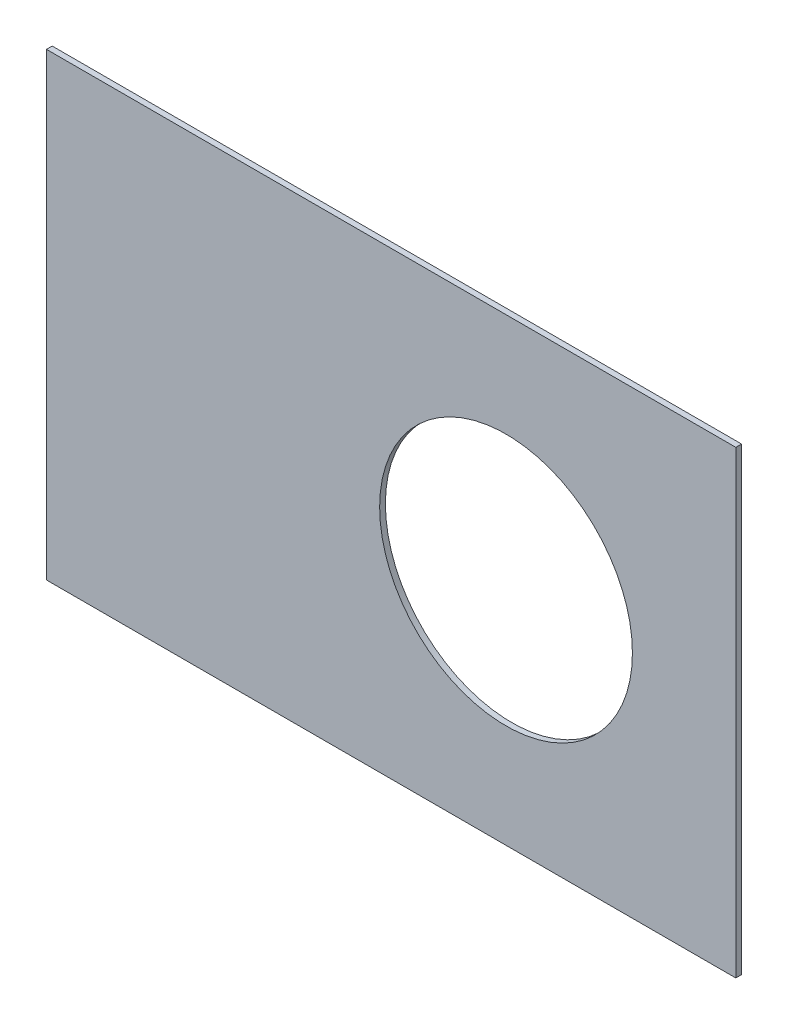
ISO-10303-21;
HEADER;
FILE_DESCRIPTION(('STEP AP214'),'2;1');
FILE_NAME('part.step','',(''),(''),'','','');
FILE_SCHEMA(('AUTOMOTIVE_DESIGN { 1 0 10303 214 1 1 1 1 }'));
ENDSEC;
DATA;
#1=APPLICATION_CONTEXT('core data for automotive mechanical design processes');
#2=APPLICATION_PROTOCOL_DEFINITION('international standard','automotive_design',2000,#1);
#3=PRODUCT_CONTEXT('',#1,'mechanical');
#4=PRODUCT('Part','Part','',(#3));
#5=PRODUCT_RELATED_PRODUCT_CATEGORY('part','',(#4));
#6=PRODUCT_DEFINITION_FORMATION('','',#4);
#7=PRODUCT_DEFINITION_CONTEXT('part definition',#1,'design');
#8=PRODUCT_DEFINITION('design','',#6,#7);
#9=PRODUCT_DEFINITION_SHAPE('','',#8);
#10=(LENGTH_UNIT() NAMED_UNIT(*) SI_UNIT(.MILLI.,.METRE.));
#11=(NAMED_UNIT(*) PLANE_ANGLE_UNIT() SI_UNIT($,.RADIAN.));
#12=(NAMED_UNIT(*) SI_UNIT($,.STERADIAN.) SOLID_ANGLE_UNIT());
#13=UNCERTAINTY_MEASURE_WITH_UNIT(LENGTH_MEASURE(1.E-05),#10,'distance_accuracy_value','');
#14=(GEOMETRIC_REPRESENTATION_CONTEXT(3) GLOBAL_UNCERTAINTY_ASSIGNED_CONTEXT((#13)) GLOBAL_UNIT_ASSIGNED_CONTEXT((#10,
#11,#12)) REPRESENTATION_CONTEXT('',''));
#15=CARTESIAN_POINT('',(0.,0.,0.));
#16=DIRECTION('',(0.,0.,1.));
#17=DIRECTION('',(1.,0.,0.));
#18=AXIS2_PLACEMENT_3D('',#15,#16,#17);
#19=CARTESIAN_POINT('',(10.,0.,-10.));
#20=DIRECTION('',(0.,0.,1.));
#21=DIRECTION('',(1.,0.,0.));
#22=AXIS2_PLACEMENT_3D('',#19,#20,#21);
#23=CYLINDRICAL_SURFACE('',#22,11.);
#24=CARTESIAN_POINT('',(10.,0.,-0.5));
#25=DIRECTION('',(0.,0.,-1.));
#26=DIRECTION('',(-1.,0.,0.));
#27=AXIS2_PLACEMENT_3D('',#24,#25,#26);
#28=CIRCLE('',#27,11.);
#29=CARTESIAN_POINT('',(-0.999999999999999,0.,-0.5));
#30=VERTEX_POINT('',#29);
#31=EDGE_CURVE('E20',#30,#30,#28,.T.);
#32=ORIENTED_EDGE('',*,*,#31,.T.);
#33=EDGE_LOOP('',(#32));
#34=FACE_BOUND('',#33,.T.);
#35=CARTESIAN_POINT('',(10.,0.,0.));
#36=DIRECTION('',(0.,0.,1.));
#37=DIRECTION('',(1.,0.,0.));
#38=AXIS2_PLACEMENT_3D('',#35,#36,#37);
#39=CIRCLE('',#38,11.);
#40=CARTESIAN_POINT('',(21.,0.,0.));
#41=VERTEX_POINT('',#40);
#42=EDGE_CURVE('E11',#41,#41,#39,.T.);
#43=ORIENTED_EDGE('',*,*,#42,.T.);
#44=EDGE_LOOP('',(#43));
#45=FACE_BOUND('',#44,.T.);
#46=ADVANCED_FACE('F17',(#34,#45),#23,.F.);
#47=CARTESIAN_POINT('',(0.,0.,0.));
#48=DIRECTION('',(0.,0.,-1.));
#49=DIRECTION('',(0.,-1.,0.));
#50=AXIS2_PLACEMENT_3D('',#47,#48,#49);
#51=PLANE('',#50);
#52=ORIENTED_EDGE('',*,*,#42,.F.);
#53=EDGE_LOOP('',(#52));
#54=FACE_BOUND('',#53,.T.);
#55=DIRECTION('',(0.,1.,0.));
#56=VECTOR('',#55,1.);
#57=CARTESIAN_POINT('',(30.,-20.,0.));
#58=LINE('',#57,#56);
#59=CARTESIAN_POINT('',(30.,-20.,0.));
#60=VERTEX_POINT('',#59);
#61=CARTESIAN_POINT('',(30.,20.,0.));
#62=VERTEX_POINT('',#61);
#63=EDGE_CURVE('E77',#60,#62,#58,.T.);
#64=ORIENTED_EDGE('',*,*,#63,.T.);
#65=DIRECTION('',(-1.,0.,0.));
#66=VECTOR('',#65,1.);
#67=CARTESIAN_POINT('',(-30.,20.,0.));
#68=LINE('',#67,#66);
#69=CARTESIAN_POINT('',(-30.,20.,0.));
#70=VERTEX_POINT('',#69);
#71=EDGE_CURVE('E49',#62,#70,#68,.T.);
#72=ORIENTED_EDGE('',*,*,#71,.T.);
#73=DIRECTION('',(0.,-1.,0.));
#74=VECTOR('',#73,1.);
#75=CARTESIAN_POINT('',(-30.,-20.,0.));
#76=LINE('',#75,#74);
#77=CARTESIAN_POINT('',(-30.,-20.,0.));
#78=VERTEX_POINT('',#77);
#79=EDGE_CURVE('E79',#70,#78,#76,.T.);
#80=ORIENTED_EDGE('',*,*,#79,.T.);
#81=DIRECTION('',(1.,0.,0.));
#82=VECTOR('',#81,1.);
#83=CARTESIAN_POINT('',(-30.,-20.,0.));
#84=LINE('',#83,#82);
#85=EDGE_CURVE('E73',#78,#60,#84,.T.);
#86=ORIENTED_EDGE('',*,*,#85,.T.);
#87=EDGE_LOOP('',(#64,#72,#80,#86));
#88=FACE_BOUND('',#87,.T.);
#89=ADVANCED_FACE('F75',(#54,#88),#51,.F.);
#90=CARTESIAN_POINT('',(0.,0.,-0.5));
#91=DIRECTION('',(0.,0.,-1.));
#92=DIRECTION('',(0.,-1.,0.));
#93=AXIS2_PLACEMENT_3D('',#90,#91,#92);
#94=PLANE('',#93);
#95=ORIENTED_EDGE('',*,*,#31,.F.);
#96=EDGE_LOOP('',(#95));
#97=FACE_BOUND('',#96,.T.);
#98=DIRECTION('',(0.,1.,0.));
#99=VECTOR('',#98,1.);
#100=CARTESIAN_POINT('',(30.,-20.,-0.5));
#101=LINE('',#100,#99);
#102=CARTESIAN_POINT('',(30.,-20.,-0.5));
#103=VERTEX_POINT('',#102);
#104=CARTESIAN_POINT('',(30.,20.,-0.5));
#105=VERTEX_POINT('',#104);
#106=EDGE_CURVE('E96',#103,#105,#101,.T.);
#107=ORIENTED_EDGE('',*,*,#106,.F.);
#108=DIRECTION('',(1.,0.,0.));
#109=VECTOR('',#108,1.);
#110=CARTESIAN_POINT('',(-30.,-20.,-0.5));
#111=LINE('',#110,#109);
#112=CARTESIAN_POINT('',(-30.,-20.,-0.5));
#113=VERTEX_POINT('',#112);
#114=EDGE_CURVE('E91',#113,#103,#111,.T.);
#115=ORIENTED_EDGE('',*,*,#114,.F.);
#116=DIRECTION('',(0.,-1.,0.));
#117=VECTOR('',#116,1.);
#118=CARTESIAN_POINT('',(-30.,-20.,-0.5));
#119=LINE('',#118,#117);
#120=CARTESIAN_POINT('',(-30.,20.,-0.5));
#121=VERTEX_POINT('',#120);
#122=EDGE_CURVE('E115',#121,#113,#119,.T.);
#123=ORIENTED_EDGE('',*,*,#122,.F.);
#124=DIRECTION('',(-1.,0.,0.));
#125=VECTOR('',#124,1.);
#126=CARTESIAN_POINT('',(-30.,20.,-0.5));
#127=LINE('',#126,#125);
#128=EDGE_CURVE('E38',#105,#121,#127,.T.);
#129=ORIENTED_EDGE('',*,*,#128,.F.);
#130=EDGE_LOOP('',(#107,#115,#123,#129));
#131=FACE_BOUND('',#130,.T.);
#132=ADVANCED_FACE('F208',(#97,#131),#94,.T.);
#133=CARTESIAN_POINT('',(-30.,20.,-0.5));
#134=DIRECTION('',(0.,1.,0.));
#135=DIRECTION('',(1.,0.,0.));
#136=AXIS2_PLACEMENT_3D('',#133,#134,#135);
#137=PLANE('',#136);
#138=ORIENTED_EDGE('',*,*,#71,.F.);
#139=DIRECTION('',(0.,0.,1.));
#140=VECTOR('',#139,1.);
#141=CARTESIAN_POINT('',(30.,20.,-0.5));
#142=LINE('',#141,#140);
#143=EDGE_CURVE('E85',#105,#62,#142,.T.);
#144=ORIENTED_EDGE('',*,*,#143,.F.);
#145=ORIENTED_EDGE('',*,*,#128,.T.);
#146=DIRECTION('',(0.,0.,1.));
#147=VECTOR('',#146,1.);
#148=CARTESIAN_POINT('',(-30.,20.,-0.5));
#149=LINE('',#148,#147);
#150=EDGE_CURVE('E112',#121,#70,#149,.T.);
#151=ORIENTED_EDGE('',*,*,#150,.T.);
#152=EDGE_LOOP('',(#138,#144,#145,#151));
#153=FACE_BOUND('',#152,.T.);
#154=ADVANCED_FACE('F212',(#153),#137,.T.);
#155=CARTESIAN_POINT('',(-30.,-20.,-0.5));
#156=DIRECTION('',(-1.,0.,0.));
#157=DIRECTION('',(0.,0.,1.));
#158=AXIS2_PLACEMENT_3D('',#155,#156,#157);
#159=PLANE('',#158);
#160=ORIENTED_EDGE('',*,*,#79,.F.);
#161=ORIENTED_EDGE('',*,*,#150,.F.);
#162=ORIENTED_EDGE('',*,*,#122,.T.);
#163=DIRECTION('',(0.,0.,1.));
#164=VECTOR('',#163,1.);
#165=CARTESIAN_POINT('',(-30.,-20.,-0.5));
#166=LINE('',#165,#164);
#167=EDGE_CURVE('E84',#113,#78,#166,.T.);
#168=ORIENTED_EDGE('',*,*,#167,.T.);
#169=EDGE_LOOP('',(#160,#161,#162,#168));
#170=FACE_BOUND('',#169,.T.);
#171=ADVANCED_FACE('F221',(#170),#159,.T.);
#172=CARTESIAN_POINT('',(-30.,-20.,-0.5));
#173=DIRECTION('',(0.,-1.,0.));
#174=DIRECTION('',(0.,0.,-1.));
#175=AXIS2_PLACEMENT_3D('',#172,#173,#174);
#176=PLANE('',#175);
#177=ORIENTED_EDGE('',*,*,#85,.F.);
#178=ORIENTED_EDGE('',*,*,#167,.F.);
#179=ORIENTED_EDGE('',*,*,#114,.T.);
#180=DIRECTION('',(0.,0.,1.));
#181=VECTOR('',#180,1.);
#182=CARTESIAN_POINT('',(30.,-20.,-0.5));
#183=LINE('',#182,#181);
#184=EDGE_CURVE('E88',#103,#60,#183,.T.);
#185=ORIENTED_EDGE('',*,*,#184,.T.);
#186=EDGE_LOOP('',(#177,#178,#179,#185));
#187=FACE_BOUND('',#186,.T.);
#188=ADVANCED_FACE('F89',(#187),#176,.T.);
#189=CARTESIAN_POINT('',(30.,-20.,-0.5));
#190=DIRECTION('',(1.,0.,0.));
#191=DIRECTION('',(0.,1.,0.));
#192=AXIS2_PLACEMENT_3D('',#189,#190,#191);
#193=PLANE('',#192);
#194=ORIENTED_EDGE('',*,*,#63,.F.);
#195=ORIENTED_EDGE('',*,*,#184,.F.);
#196=ORIENTED_EDGE('',*,*,#106,.T.);
#197=ORIENTED_EDGE('',*,*,#143,.T.);
#198=EDGE_LOOP('',(#194,#195,#196,#197));
#199=FACE_BOUND('',#198,.T.);
#200=ADVANCED_FACE('F99',(#199),#193,.T.);
#201=CLOSED_SHELL('',(#46,#89,#132,#154,#171,#188,#200));
#202=MANIFOLD_SOLID_BREP('B1',#201);
#203=ADVANCED_BREP_SHAPE_REPRESENTATION('',(#18,#202),#14);
#204=SHAPE_DEFINITION_REPRESENTATION(#9,#203);
ENDSEC;
END-ISO-10303-21;
